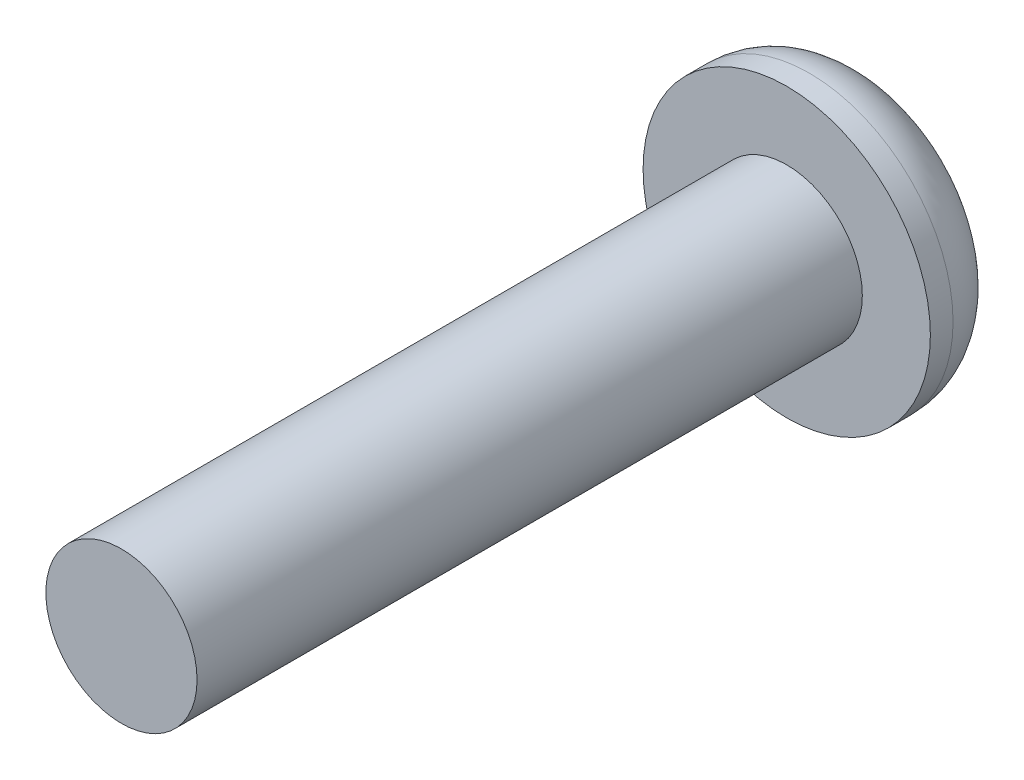
ISO-10303-21;
HEADER;
FILE_DESCRIPTION(('STEP AP214'),'2;1');
FILE_NAME('part.step','',(''),(''),'','','');
FILE_SCHEMA(('AUTOMOTIVE_DESIGN { 1 0 10303 214 1 1 1 1 }'));
ENDSEC;
DATA;
#1=APPLICATION_CONTEXT('core data for automotive mechanical design processes');
#2=APPLICATION_PROTOCOL_DEFINITION('international standard','automotive_design',2000,#1);
#3=PRODUCT_CONTEXT('',#1,'mechanical');
#4=PRODUCT('Part','Part','',(#3));
#5=PRODUCT_RELATED_PRODUCT_CATEGORY('part','',(#4));
#6=PRODUCT_DEFINITION_FORMATION('','',#4);
#7=PRODUCT_DEFINITION_CONTEXT('part definition',#1,'design');
#8=PRODUCT_DEFINITION('design','',#6,#7);
#9=PRODUCT_DEFINITION_SHAPE('','',#8);
#10=(LENGTH_UNIT() NAMED_UNIT(*) SI_UNIT(.MILLI.,.METRE.));
#11=(NAMED_UNIT(*) PLANE_ANGLE_UNIT() SI_UNIT($,.RADIAN.));
#12=(NAMED_UNIT(*) SI_UNIT($,.STERADIAN.) SOLID_ANGLE_UNIT());
#13=UNCERTAINTY_MEASURE_WITH_UNIT(LENGTH_MEASURE(1.E-05),#10,'distance_accuracy_value','');
#14=(GEOMETRIC_REPRESENTATION_CONTEXT(3) GLOBAL_UNCERTAINTY_ASSIGNED_CONTEXT((#13)) GLOBAL_UNIT_ASSIGNED_CONTEXT((#10,
#11,#12)) REPRESENTATION_CONTEXT('',''));
#15=CARTESIAN_POINT('',(0.,0.,0.));
#16=DIRECTION('',(0.,0.,1.));
#17=DIRECTION('',(1.,0.,0.));
#18=AXIS2_PLACEMENT_3D('',#15,#16,#17);
#19=CARTESIAN_POINT('',(0.,0.,22.));
#20=DIRECTION('',(0.,0.,-1.));
#21=DIRECTION('',(-1.,0.,0.));
#22=AXIS2_PLACEMENT_3D('',#19,#20,#21);
#23=CYLINDRICAL_SURFACE('',#22,2.5);
#24=CARTESIAN_POINT('',(0.,0.,22.));
#25=DIRECTION('',(0.,0.,1.));
#26=DIRECTION('',(1.,0.,0.));
#27=AXIS2_PLACEMENT_3D('',#24,#25,#26);
#28=CIRCLE('',#27,2.5);
#29=CARTESIAN_POINT('',(2.5,0.,22.));
#30=VERTEX_POINT('',#29);
#31=EDGE_CURVE('E50',#30,#30,#28,.T.);
#32=ORIENTED_EDGE('',*,*,#31,.F.);
#33=EDGE_LOOP('',(#32));
#34=FACE_BOUND('',#33,.T.);
#35=CARTESIAN_POINT('',(0.,0.,0.));
#36=DIRECTION('',(0.,0.,1.));
#37=DIRECTION('',(1.,0.,0.));
#38=AXIS2_PLACEMENT_3D('',#35,#36,#37);
#39=CIRCLE('',#38,2.5);
#40=CARTESIAN_POINT('',(2.5,0.,0.));
#41=VERTEX_POINT('',#40);
#42=EDGE_CURVE('E55',#41,#41,#39,.T.);
#43=ORIENTED_EDGE('',*,*,#42,.T.);
#44=EDGE_LOOP('',(#43));
#45=FACE_BOUND('',#44,.T.);
#46=ADVANCED_FACE('F37',(#34,#45),#23,.T.);
#47=CARTESIAN_POINT('',(0.,0.,22.));
#48=DIRECTION('',(0.,0.,1.));
#49=DIRECTION('',(1.,0.,0.));
#50=AXIS2_PLACEMENT_3D('',#47,#48,#49);
#51=PLANE('',#50);
#52=ORIENTED_EDGE('',*,*,#31,.T.);
#53=EDGE_LOOP('',(#52));
#54=FACE_BOUND('',#53,.T.);
#55=ADVANCED_FACE('F82',(#54),#51,.T.);
#56=CARTESIAN_POINT('',(0.,0.,-2.75));
#57=DIRECTION('',(0.,0.,1.));
#58=DIRECTION('',(1.,0.,0.));
#59=AXIS2_PLACEMENT_3D('',#56,#57,#58);
#60=CYLINDRICAL_SURFACE('',#59,4.75);
#61=CARTESIAN_POINT('',(0.,0.,-0.75));
#62=DIRECTION('',(0.,0.,-1.));
#63=DIRECTION('',(-1.,0.,0.));
#64=AXIS2_PLACEMENT_3D('',#61,#62,#63);
#65=CIRCLE('',#64,4.75);
#66=CARTESIAN_POINT('',(-4.75,0.,-0.75));
#67=VERTEX_POINT('',#66);
#68=EDGE_CURVE('E10',#67,#67,#65,.F.);
#69=ORIENTED_EDGE('',*,*,#68,.T.);
#70=EDGE_LOOP('',(#69));
#71=FACE_BOUND('',#70,.T.);
#72=CARTESIAN_POINT('',(0.,0.,0.));
#73=DIRECTION('',(0.,0.,-1.));
#74=DIRECTION('',(-1.,0.,0.));
#75=AXIS2_PLACEMENT_3D('',#72,#73,#74);
#76=CIRCLE('',#75,4.75);
#77=CARTESIAN_POINT('',(-4.75,0.,0.));
#78=VERTEX_POINT('',#77);
#79=EDGE_CURVE('E60',#78,#78,#76,.T.);
#80=ORIENTED_EDGE('',*,*,#79,.T.);
#81=EDGE_LOOP('',(#80));
#82=FACE_BOUND('',#81,.T.);
#83=ADVANCED_FACE('F66',(#71,#82),#60,.T.);
#84=CARTESIAN_POINT('',(0.,0.,-2.75));
#85=DIRECTION('',(0.,0.,-1.));
#86=DIRECTION('',(-1.,0.,0.));
#87=AXIS2_PLACEMENT_3D('',#84,#85,#86);
#88=PLANE('',#87);
#89=CARTESIAN_POINT('',(0.,0.,-2.75));
#90=DIRECTION('',(0.,0.,-1.));
#91=DIRECTION('',(-1.,0.,0.));
#92=AXIS2_PLACEMENT_3D('',#89,#90,#91);
#93=CIRCLE('',#92,2.75);
#94=CARTESIAN_POINT('',(-2.75,0.,-2.75));
#95=VERTEX_POINT('',#94);
#96=EDGE_CURVE('E45',#95,#95,#93,.T.);
#97=ORIENTED_EDGE('',*,*,#96,.T.);
#98=EDGE_LOOP('',(#97));
#99=FACE_BOUND('',#98,.T.);
#100=ADVANCED_FACE('F70',(#99),#88,.T.);
#101=CARTESIAN_POINT('',(0.,0.,0.));
#102=DIRECTION('',(0.,0.,-1.));
#103=DIRECTION('',(-1.,0.,0.));
#104=AXIS2_PLACEMENT_3D('',#101,#102,#103);
#105=PLANE('',#104);
#106=ORIENTED_EDGE('',*,*,#42,.F.);
#107=EDGE_LOOP('',(#106));
#108=FACE_BOUND('',#107,.T.);
#109=ORIENTED_EDGE('',*,*,#79,.F.);
#110=EDGE_LOOP('',(#109));
#111=FACE_BOUND('',#110,.T.);
#112=ADVANCED_FACE('F68',(#108,#111),#105,.F.);
#113=CARTESIAN_POINT('',(0.,0.,-0.75));
#114=DIRECTION('',(0.,0.,-1.));
#115=DIRECTION('',(-1.,0.,0.));
#116=AXIS2_PLACEMENT_3D('',#113,#114,#115);
#117=TOROIDAL_SURFACE('',#116,2.75,2.);
#118=ORIENTED_EDGE('',*,*,#68,.F.);
#119=EDGE_LOOP('',(#118));
#120=FACE_BOUND('',#119,.T.);
#121=ORIENTED_EDGE('',*,*,#96,.F.);
#122=EDGE_LOOP('',(#121));
#123=FACE_BOUND('',#122,.T.);
#124=ADVANCED_FACE('F39',(#120,#123),#117,.T.);
#125=CLOSED_SHELL('',(#46,#55,#83,#100,#112,#124));
#126=MANIFOLD_SOLID_BREP('B2',#125);
#127=ADVANCED_BREP_SHAPE_REPRESENTATION('',(#18,#126),#14);
#128=SHAPE_DEFINITION_REPRESENTATION(#9,#127);
ENDSEC;
END-ISO-10303-21;
